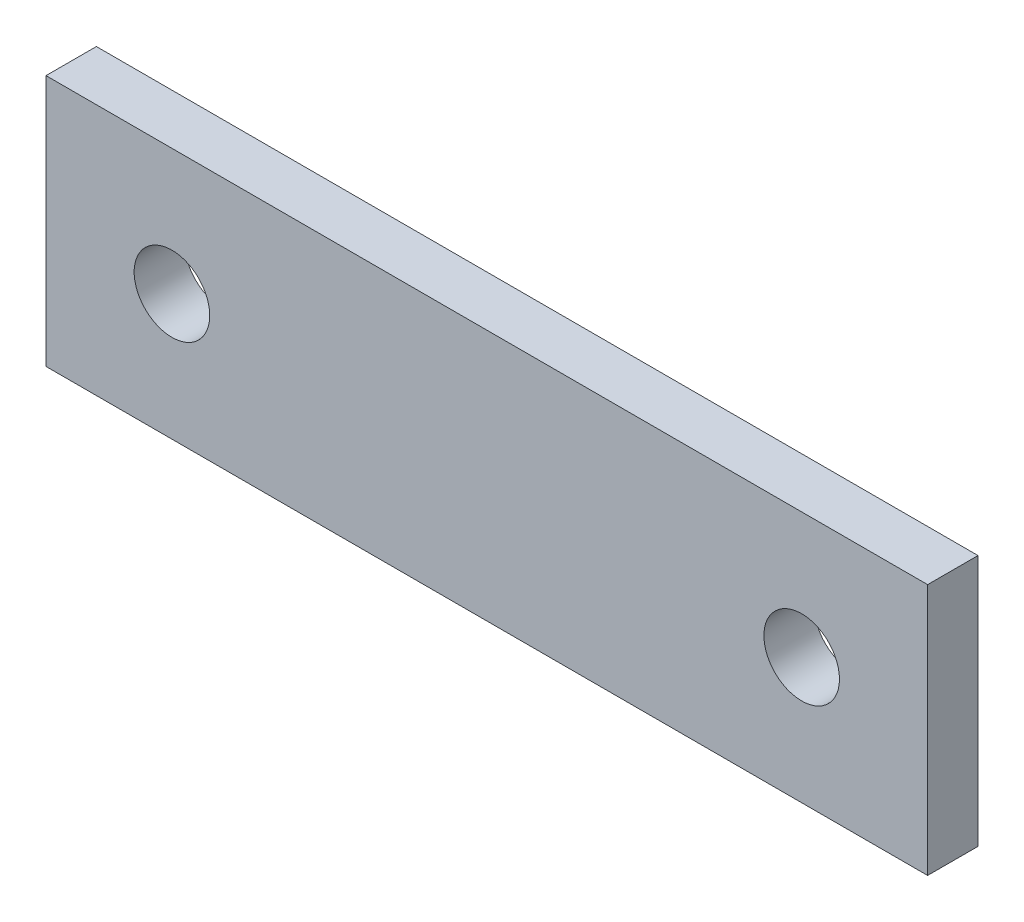
ISO-10303-21;
HEADER;
FILE_DESCRIPTION(('STEP AP214'),'2;1');
FILE_NAME('part.step','',(''),(''),'','','');
FILE_SCHEMA(('AUTOMOTIVE_DESIGN { 1 0 10303 214 1 1 1 1 }'));
ENDSEC;
DATA;
#1=APPLICATION_CONTEXT('core data for automotive mechanical design processes');
#2=APPLICATION_PROTOCOL_DEFINITION('international standard','automotive_design',2000,#1);
#3=PRODUCT_CONTEXT('',#1,'mechanical');
#4=PRODUCT('Part','Part','',(#3));
#5=PRODUCT_RELATED_PRODUCT_CATEGORY('part','',(#4));
#6=PRODUCT_DEFINITION_FORMATION('','',#4);
#7=PRODUCT_DEFINITION_CONTEXT('part definition',#1,'design');
#8=PRODUCT_DEFINITION('design','',#6,#7);
#9=PRODUCT_DEFINITION_SHAPE('','',#8);
#10=(LENGTH_UNIT() NAMED_UNIT(*) SI_UNIT(.MILLI.,.METRE.));
#11=(NAMED_UNIT(*) PLANE_ANGLE_UNIT() SI_UNIT($,.RADIAN.));
#12=(NAMED_UNIT(*) SI_UNIT($,.STERADIAN.) SOLID_ANGLE_UNIT());
#13=UNCERTAINTY_MEASURE_WITH_UNIT(LENGTH_MEASURE(1.E-05),#10,'distance_accuracy_value','');
#14=(GEOMETRIC_REPRESENTATION_CONTEXT(3) GLOBAL_UNCERTAINTY_ASSIGNED_CONTEXT((#13)) GLOBAL_UNIT_ASSIGNED_CONTEXT((#10,
#11,#12)) REPRESENTATION_CONTEXT('',''));
#15=CARTESIAN_POINT('',(0.,0.,0.));
#16=DIRECTION('',(0.,0.,1.));
#17=DIRECTION('',(1.,0.,0.));
#18=AXIS2_PLACEMENT_3D('',#15,#16,#17);
#19=CARTESIAN_POINT('',(0.,0.,2.));
#20=DIRECTION('',(0.,0.,-1.));
#21=DIRECTION('',(-1.,0.,0.));
#22=AXIS2_PLACEMENT_3D('',#19,#20,#21);
#23=PLANE('',#22);
#24=CARTESIAN_POINT('',(5.,5.,2.));
#25=DIRECTION('',(0.,0.,1.));
#26=DIRECTION('',(1.,0.,0.));
#27=AXIS2_PLACEMENT_3D('',#24,#25,#26);
#28=CIRCLE('',#27,1.5);
#29=CARTESIAN_POINT('',(6.5,5.,2.));
#30=VERTEX_POINT('',#29);
#31=EDGE_CURVE('E101',#30,#30,#28,.T.);
#32=ORIENTED_EDGE('',*,*,#31,.F.);
#33=EDGE_LOOP('',(#32));
#34=FACE_BOUND('',#33,.T.);
#35=DIRECTION('',(0.,-1.,0.));
#36=VECTOR('',#35,1.);
#37=CARTESIAN_POINT('',(0.,0.,2.));
#38=LINE('',#37,#36);
#39=CARTESIAN_POINT('',(0.,10.,2.));
#40=VERTEX_POINT('',#39);
#41=CARTESIAN_POINT('',(0.,0.,2.));
#42=VERTEX_POINT('',#41);
#43=EDGE_CURVE('E86',#40,#42,#38,.T.);
#44=ORIENTED_EDGE('',*,*,#43,.T.);
#45=DIRECTION('',(1.,0.,0.));
#46=VECTOR('',#45,1.);
#47=CARTESIAN_POINT('',(0.,0.,2.));
#48=LINE('',#47,#46);
#49=CARTESIAN_POINT('',(35.,0.,2.));
#50=VERTEX_POINT('',#49);
#51=EDGE_CURVE('E81',#42,#50,#48,.T.);
#52=ORIENTED_EDGE('',*,*,#51,.T.);
#53=DIRECTION('',(0.,1.,0.));
#54=VECTOR('',#53,1.);
#55=CARTESIAN_POINT('',(35.,0.,2.));
#56=LINE('',#55,#54);
#57=CARTESIAN_POINT('',(35.,10.,2.));
#58=VERTEX_POINT('',#57);
#59=EDGE_CURVE('E84',#50,#58,#56,.T.);
#60=ORIENTED_EDGE('',*,*,#59,.T.);
#61=DIRECTION('',(-1.,0.,0.));
#62=VECTOR('',#61,1.);
#63=CARTESIAN_POINT('',(0.,10.,2.));
#64=LINE('',#63,#62);
#65=EDGE_CURVE('E51',#58,#40,#64,.T.);
#66=ORIENTED_EDGE('',*,*,#65,.T.);
#67=EDGE_LOOP('',(#44,#52,#60,#66));
#68=FACE_BOUND('',#67,.T.);
#69=CARTESIAN_POINT('',(30.,5.,2.));
#70=DIRECTION('',(0.,0.,1.));
#71=DIRECTION('',(1.,0.,0.));
#72=AXIS2_PLACEMENT_3D('',#69,#70,#71);
#73=CIRCLE('',#72,1.5);
#74=CARTESIAN_POINT('',(31.5,5.,2.));
#75=VERTEX_POINT('',#74);
#76=EDGE_CURVE('E116',#75,#75,#73,.T.);
#77=ORIENTED_EDGE('',*,*,#76,.F.);
#78=EDGE_LOOP('',(#77));
#79=FACE_BOUND('',#78,.T.);
#80=ADVANCED_FACE('F34',(#34,#68,#79),#23,.F.);
#81=CARTESIAN_POINT('',(0.,0.,0.));
#82=DIRECTION('',(0.,0.,-1.));
#83=DIRECTION('',(-1.,0.,0.));
#84=AXIS2_PLACEMENT_3D('',#81,#82,#83);
#85=PLANE('',#84);
#86=CARTESIAN_POINT('',(5.,5.,0.));
#87=DIRECTION('',(0.,0.,1.));
#88=DIRECTION('',(1.,0.,0.));
#89=AXIS2_PLACEMENT_3D('',#86,#87,#88);
#90=CIRCLE('',#89,1.5);
#91=CARTESIAN_POINT('',(6.5,5.,0.));
#92=VERTEX_POINT('',#91);
#93=EDGE_CURVE('E113',#92,#92,#90,.T.);
#94=ORIENTED_EDGE('',*,*,#93,.T.);
#95=EDGE_LOOP('',(#94));
#96=FACE_BOUND('',#95,.T.);
#97=DIRECTION('',(0.,-1.,0.));
#98=VECTOR('',#97,1.);
#99=CARTESIAN_POINT('',(0.,0.,0.));
#100=LINE('',#99,#98);
#101=CARTESIAN_POINT('',(0.,10.,0.));
#102=VERTEX_POINT('',#101);
#103=CARTESIAN_POINT('',(0.,0.,0.));
#104=VERTEX_POINT('',#103);
#105=EDGE_CURVE('E98',#102,#104,#100,.T.);
#106=ORIENTED_EDGE('',*,*,#105,.F.);
#107=DIRECTION('',(-1.,0.,0.));
#108=VECTOR('',#107,1.);
#109=CARTESIAN_POINT('',(0.,10.,0.));
#110=LINE('',#109,#108);
#111=CARTESIAN_POINT('',(35.,10.,0.));
#112=VERTEX_POINT('',#111);
#113=EDGE_CURVE('E74',#112,#102,#110,.T.);
#114=ORIENTED_EDGE('',*,*,#113,.F.);
#115=DIRECTION('',(0.,1.,0.));
#116=VECTOR('',#115,1.);
#117=CARTESIAN_POINT('',(35.,0.,0.));
#118=LINE('',#117,#116);
#119=CARTESIAN_POINT('',(35.,0.,0.));
#120=VERTEX_POINT('',#119);
#121=EDGE_CURVE('E68',#120,#112,#118,.T.);
#122=ORIENTED_EDGE('',*,*,#121,.F.);
#123=DIRECTION('',(1.,0.,0.));
#124=VECTOR('',#123,1.);
#125=CARTESIAN_POINT('',(0.,0.,0.));
#126=LINE('',#125,#124);
#127=EDGE_CURVE('E90',#104,#120,#126,.T.);
#128=ORIENTED_EDGE('',*,*,#127,.F.);
#129=EDGE_LOOP('',(#106,#114,#122,#128));
#130=FACE_BOUND('',#129,.T.);
#131=CARTESIAN_POINT('',(30.,5.,0.));
#132=DIRECTION('',(0.,0.,1.));
#133=DIRECTION('',(1.,0.,0.));
#134=AXIS2_PLACEMENT_3D('',#131,#132,#133);
#135=CIRCLE('',#134,1.5);
#136=CARTESIAN_POINT('',(31.5,5.,0.));
#137=VERTEX_POINT('',#136);
#138=EDGE_CURVE('E119',#137,#137,#135,.T.);
#139=ORIENTED_EDGE('',*,*,#138,.T.);
#140=EDGE_LOOP('',(#139));
#141=FACE_BOUND('',#140,.T.);
#142=ADVANCED_FACE('F109',(#96,#130,#141),#85,.T.);
#143=CARTESIAN_POINT('',(0.,0.,2.));
#144=DIRECTION('',(1.,0.,0.));
#145=DIRECTION('',(0.,0.,-1.));
#146=AXIS2_PLACEMENT_3D('',#143,#144,#145);
#147=PLANE('',#146);
#148=ORIENTED_EDGE('',*,*,#105,.T.);
#149=DIRECTION('',(0.,0.,-1.));
#150=VECTOR('',#149,1.);
#151=CARTESIAN_POINT('',(0.,0.,2.));
#152=LINE('',#151,#150);
#153=EDGE_CURVE('E11',#42,#104,#152,.T.);
#154=ORIENTED_EDGE('',*,*,#153,.F.);
#155=ORIENTED_EDGE('',*,*,#43,.F.);
#156=DIRECTION('',(0.,0.,-1.));
#157=VECTOR('',#156,1.);
#158=CARTESIAN_POINT('',(0.,10.,2.));
#159=LINE('',#158,#157);
#160=EDGE_CURVE('E94',#40,#102,#159,.T.);
#161=ORIENTED_EDGE('',*,*,#160,.T.);
#162=EDGE_LOOP('',(#148,#154,#155,#161));
#163=FACE_BOUND('',#162,.T.);
#164=ADVANCED_FACE('F36',(#163),#147,.F.);
#165=CARTESIAN_POINT('',(0.,0.,2.));
#166=DIRECTION('',(0.,1.,0.));
#167=DIRECTION('',(0.,0.,1.));
#168=AXIS2_PLACEMENT_3D('',#165,#166,#167);
#169=PLANE('',#168);
#170=ORIENTED_EDGE('',*,*,#127,.T.);
#171=DIRECTION('',(0.,0.,-1.));
#172=VECTOR('',#171,1.);
#173=CARTESIAN_POINT('',(35.,0.,2.));
#174=LINE('',#173,#172);
#175=EDGE_CURVE('E43',#50,#120,#174,.T.);
#176=ORIENTED_EDGE('',*,*,#175,.F.);
#177=ORIENTED_EDGE('',*,*,#51,.F.);
#178=ORIENTED_EDGE('',*,*,#153,.T.);
#179=EDGE_LOOP('',(#170,#176,#177,#178));
#180=FACE_BOUND('',#179,.T.);
#181=ADVANCED_FACE('F89',(#180),#169,.F.);
#182=CARTESIAN_POINT('',(35.,0.,2.));
#183=DIRECTION('',(-1.,0.,0.));
#184=DIRECTION('',(0.,0.,1.));
#185=AXIS2_PLACEMENT_3D('',#182,#183,#184);
#186=PLANE('',#185);
#187=ORIENTED_EDGE('',*,*,#121,.T.);
#188=DIRECTION('',(0.,0.,-1.));
#189=VECTOR('',#188,1.);
#190=CARTESIAN_POINT('',(35.,10.,2.));
#191=LINE('',#190,#189);
#192=EDGE_CURVE('E91',#58,#112,#191,.T.);
#193=ORIENTED_EDGE('',*,*,#192,.F.);
#194=ORIENTED_EDGE('',*,*,#59,.F.);
#195=ORIENTED_EDGE('',*,*,#175,.T.);
#196=EDGE_LOOP('',(#187,#193,#194,#195));
#197=FACE_BOUND('',#196,.T.);
#198=ADVANCED_FACE('F92',(#197),#186,.F.);
#199=CARTESIAN_POINT('',(0.,10.,2.));
#200=DIRECTION('',(0.,-1.,0.));
#201=DIRECTION('',(0.,0.,-1.));
#202=AXIS2_PLACEMENT_3D('',#199,#200,#201);
#203=PLANE('',#202);
#204=ORIENTED_EDGE('',*,*,#113,.T.);
#205=ORIENTED_EDGE('',*,*,#160,.F.);
#206=ORIENTED_EDGE('',*,*,#65,.F.);
#207=ORIENTED_EDGE('',*,*,#192,.T.);
#208=EDGE_LOOP('',(#204,#205,#206,#207));
#209=FACE_BOUND('',#208,.T.);
#210=ADVANCED_FACE('F106',(#209),#203,.F.);
#211=CARTESIAN_POINT('',(5.,5.,2.));
#212=DIRECTION('',(0.,0.,-1.));
#213=DIRECTION('',(-1.,0.,0.));
#214=AXIS2_PLACEMENT_3D('',#211,#212,#213);
#215=CYLINDRICAL_SURFACE('',#214,1.5);
#216=ORIENTED_EDGE('',*,*,#31,.T.);
#217=EDGE_LOOP('',(#216));
#218=FACE_BOUND('',#217,.T.);
#219=ORIENTED_EDGE('',*,*,#93,.F.);
#220=EDGE_LOOP('',(#219));
#221=FACE_BOUND('',#220,.T.);
#222=ADVANCED_FACE('F137',(#218,#221),#215,.F.);
#223=CARTESIAN_POINT('',(30.,5.,2.));
#224=DIRECTION('',(0.,0.,-1.));
#225=DIRECTION('',(-1.,0.,0.));
#226=AXIS2_PLACEMENT_3D('',#223,#224,#225);
#227=CYLINDRICAL_SURFACE('',#226,1.5);
#228=ORIENTED_EDGE('',*,*,#76,.T.);
#229=EDGE_LOOP('',(#228));
#230=FACE_BOUND('',#229,.T.);
#231=ORIENTED_EDGE('',*,*,#138,.F.);
#232=EDGE_LOOP('',(#231));
#233=FACE_BOUND('',#232,.T.);
#234=ADVANCED_FACE('F125',(#230,#233),#227,.F.);
#235=CLOSED_SHELL('',(#80,#142,#164,#181,#198,#210,#222,#234));
#236=MANIFOLD_SOLID_BREP('B2',#235);
#237=ADVANCED_BREP_SHAPE_REPRESENTATION('',(#18,#236),#14);
#238=SHAPE_DEFINITION_REPRESENTATION(#9,#237);
ENDSEC;
END-ISO-10303-21;
